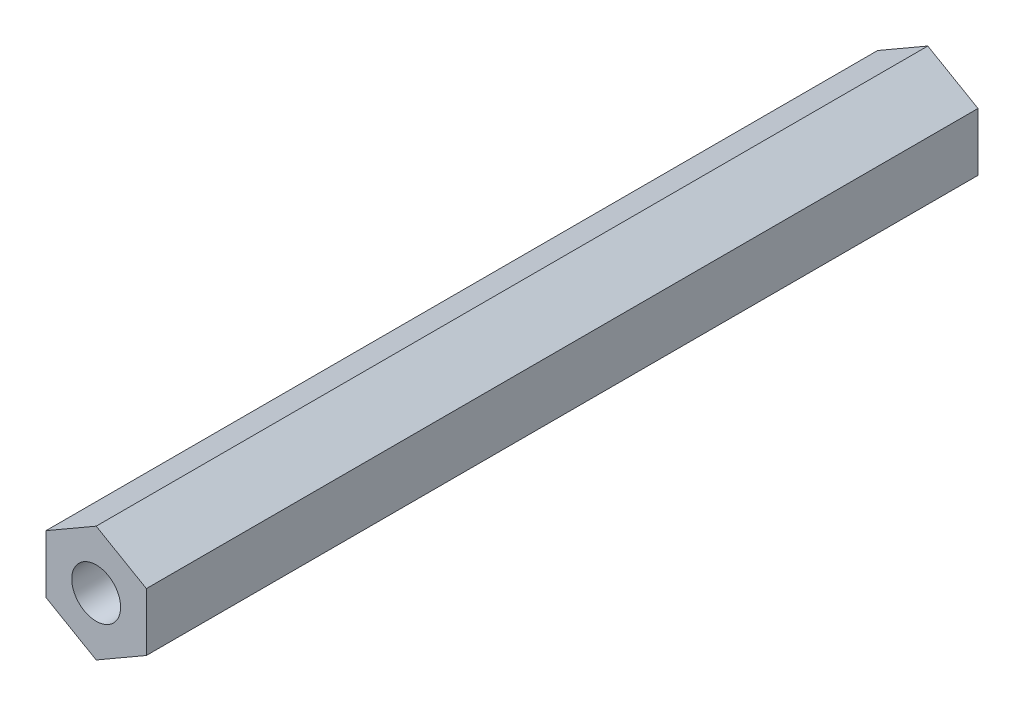
ISO-10303-21;
HEADER;
FILE_DESCRIPTION(('STEP AP214'),'2;1');
FILE_NAME('part.step','',(''),(''),'','','');
FILE_SCHEMA(('AUTOMOTIVE_DESIGN { 1 0 10303 214 1 1 1 1 }'));
ENDSEC;
DATA;
#1=APPLICATION_CONTEXT('core data for automotive mechanical design processes');
#2=APPLICATION_PROTOCOL_DEFINITION('international standard','automotive_design',2000,#1);
#3=PRODUCT_CONTEXT('',#1,'mechanical');
#4=PRODUCT('Part','Part','',(#3));
#5=PRODUCT_RELATED_PRODUCT_CATEGORY('part','',(#4));
#6=PRODUCT_DEFINITION_FORMATION('','',#4);
#7=PRODUCT_DEFINITION_CONTEXT('part definition',#1,'design');
#8=PRODUCT_DEFINITION('design','',#6,#7);
#9=PRODUCT_DEFINITION_SHAPE('','',#8);
#10=(LENGTH_UNIT() NAMED_UNIT(*) SI_UNIT(.MILLI.,.METRE.));
#11=(NAMED_UNIT(*) PLANE_ANGLE_UNIT() SI_UNIT($,.RADIAN.));
#12=(NAMED_UNIT(*) SI_UNIT($,.STERADIAN.) SOLID_ANGLE_UNIT());
#13=UNCERTAINTY_MEASURE_WITH_UNIT(LENGTH_MEASURE(1.E-05),#10,'distance_accuracy_value','');
#14=(GEOMETRIC_REPRESENTATION_CONTEXT(3) GLOBAL_UNCERTAINTY_ASSIGNED_CONTEXT((#13)) GLOBAL_UNIT_ASSIGNED_CONTEXT((#10,
#11,#12)) REPRESENTATION_CONTEXT('',''));
#15=CARTESIAN_POINT('',(0.,0.,0.));
#16=DIRECTION('',(0.,0.,1.));
#17=DIRECTION('',(1.,0.,0.));
#18=AXIS2_PLACEMENT_3D('',#15,#16,#17);
#19=CARTESIAN_POINT('',(5.55624999999995,3.20790243318492,46.0375));
#20=DIRECTION('',(-0.499999999999995,-0.866025403784441,0.));
#21=DIRECTION('',(0.866025403784442,-0.499999999999995,0.));
#22=AXIS2_PLACEMENT_3D('',#19,#20,#21);
#23=PLANE('',#22);
#24=DIRECTION('',(-0.866025403784442,0.499999999999995,0.));
#25=VECTOR('',#24,1.);
#26=CARTESIAN_POINT('',(5.55624999999995,3.20790243318492,-46.0375));
#27=LINE('',#26,#25);
#28=CARTESIAN_POINT('',(5.55624999999995,3.20790243318492,-46.0375));
#29=VERTEX_POINT('',#28);
#30=CARTESIAN_POINT('',(0.,6.41580486636971,-46.0375));
#31=VERTEX_POINT('',#30);
#32=EDGE_CURVE('E123',#29,#31,#27,.T.);
#33=ORIENTED_EDGE('',*,*,#32,.T.);
#34=DIRECTION('',(0.,0.,-1.));
#35=VECTOR('',#34,1.);
#36=CARTESIAN_POINT('',(0.,6.41580486636971,46.0375));
#37=LINE('',#36,#35);
#38=CARTESIAN_POINT('',(0.,6.41580486636971,46.0375));
#39=VERTEX_POINT('',#38);
#40=EDGE_CURVE('E11',#39,#31,#37,.T.);
#41=ORIENTED_EDGE('',*,*,#40,.F.);
#42=DIRECTION('',(-0.866025403784442,0.499999999999995,0.));
#43=VECTOR('',#42,1.);
#44=CARTESIAN_POINT('',(5.55624999999995,3.20790243318492,46.0375));
#45=LINE('',#44,#43);
#46=CARTESIAN_POINT('',(5.55624999999995,3.20790243318492,46.0375));
#47=VERTEX_POINT('',#46);
#48=EDGE_CURVE('E134',#47,#39,#45,.T.);
#49=ORIENTED_EDGE('',*,*,#48,.F.);
#50=DIRECTION('',(0.,0.,-1.));
#51=VECTOR('',#50,1.);
#52=CARTESIAN_POINT('',(5.55624999999995,3.20790243318492,46.0375));
#53=LINE('',#52,#51);
#54=EDGE_CURVE('E119',#47,#29,#53,.T.);
#55=ORIENTED_EDGE('',*,*,#54,.T.);
#56=EDGE_LOOP('',(#33,#41,#49,#55));
#57=FACE_BOUND('',#56,.T.);
#58=ADVANCED_FACE('F39',(#57),#23,.F.);
#59=CARTESIAN_POINT('',(0.,6.41580486636971,46.0375));
#60=DIRECTION('',(0.500000000000001,-0.866025403784438,0.));
#61=DIRECTION('',(0.866025403784438,0.500000000000001,0.));
#62=AXIS2_PLACEMENT_3D('',#59,#60,#61);
#63=PLANE('',#62);
#64=DIRECTION('',(-0.866025403784438,-0.500000000000001,0.));
#65=VECTOR('',#64,1.);
#66=CARTESIAN_POINT('',(0.,6.41580486636971,-46.0375));
#67=LINE('',#66,#65);
#68=CARTESIAN_POINT('',(-5.55625,3.20790243318484,-46.0375));
#69=VERTEX_POINT('',#68);
#70=EDGE_CURVE('E126',#31,#69,#67,.T.);
#71=ORIENTED_EDGE('',*,*,#70,.T.);
#72=DIRECTION('',(0.,0.,-1.));
#73=VECTOR('',#72,1.);
#74=CARTESIAN_POINT('',(-5.55625,3.20790243318484,46.0375));
#75=LINE('',#74,#73);
#76=CARTESIAN_POINT('',(-5.55625,3.20790243318484,46.0375));
#77=VERTEX_POINT('',#76);
#78=EDGE_CURVE('E47',#77,#69,#75,.T.);
#79=ORIENTED_EDGE('',*,*,#78,.F.);
#80=DIRECTION('',(-0.866025403784438,-0.500000000000001,0.));
#81=VECTOR('',#80,1.);
#82=CARTESIAN_POINT('',(0.,6.41580486636971,46.0375));
#83=LINE('',#82,#81);
#84=EDGE_CURVE('E92',#39,#77,#83,.T.);
#85=ORIENTED_EDGE('',*,*,#84,.F.);
#86=ORIENTED_EDGE('',*,*,#40,.T.);
#87=EDGE_LOOP('',(#71,#79,#85,#86));
#88=FACE_BOUND('',#87,.T.);
#89=ADVANCED_FACE('F159',(#88),#63,.F.);
#90=CARTESIAN_POINT('',(-5.55625,3.20790243318484,46.0375));
#91=DIRECTION('',(1.,0.,0.));
#92=DIRECTION('',(0.,1.,0.));
#93=AXIS2_PLACEMENT_3D('',#90,#91,#92);
#94=PLANE('',#93);
#95=DIRECTION('',(0.,-1.,0.));
#96=VECTOR('',#95,1.);
#97=CARTESIAN_POINT('',(-5.55625,3.20790243318484,-46.0375));
#98=LINE('',#97,#96);
#99=CARTESIAN_POINT('',(-5.55624999999998,-3.20790243318488,-46.0375));
#100=VERTEX_POINT('',#99);
#101=EDGE_CURVE('E129',#69,#100,#98,.T.);
#102=ORIENTED_EDGE('',*,*,#101,.T.);
#103=DIRECTION('',(0.,0.,-1.));
#104=VECTOR('',#103,1.);
#105=CARTESIAN_POINT('',(-5.55624999999998,-3.20790243318488,46.0375));
#106=LINE('',#105,#104);
#107=CARTESIAN_POINT('',(-5.55624999999998,-3.20790243318488,46.0375));
#108=VERTEX_POINT('',#107);
#109=EDGE_CURVE('E114',#108,#100,#106,.T.);
#110=ORIENTED_EDGE('',*,*,#109,.F.);
#111=DIRECTION('',(0.,-1.,0.));
#112=VECTOR('',#111,1.);
#113=CARTESIAN_POINT('',(-5.55625,3.20790243318484,46.0375));
#114=LINE('',#113,#112);
#115=EDGE_CURVE('E105',#77,#108,#114,.T.);
#116=ORIENTED_EDGE('',*,*,#115,.F.);
#117=ORIENTED_EDGE('',*,*,#78,.T.);
#118=EDGE_LOOP('',(#102,#110,#116,#117));
#119=FACE_BOUND('',#118,.T.);
#120=ADVANCED_FACE('F140',(#119),#94,.F.);
#121=CARTESIAN_POINT('',(-5.55624999999998,-3.20790243318488,46.0375));
#122=DIRECTION('',(0.499999999999995,0.866025403784441,0.));
#123=DIRECTION('',(-0.866025403784442,0.499999999999995,0.));
#124=AXIS2_PLACEMENT_3D('',#121,#122,#123);
#125=PLANE('',#124);
#126=DIRECTION('',(0.866025403784441,-0.499999999999995,0.));
#127=VECTOR('',#126,1.);
#128=CARTESIAN_POINT('',(-5.55624999999998,-3.20790243318488,-46.0375));
#129=LINE('',#128,#127);
#130=CARTESIAN_POINT('',(0.,-6.41580486636971,-46.0375));
#131=VERTEX_POINT('',#130);
#132=EDGE_CURVE('E113',#100,#131,#129,.T.);
#133=ORIENTED_EDGE('',*,*,#132,.T.);
#134=DIRECTION('',(0.,0.,-1.));
#135=VECTOR('',#134,1.);
#136=CARTESIAN_POINT('',(0.,-6.41580486636971,46.0375));
#137=LINE('',#136,#135);
#138=CARTESIAN_POINT('',(0.,-6.41580486636971,46.0375));
#139=VERTEX_POINT('',#138);
#140=EDGE_CURVE('E110',#139,#131,#137,.T.);
#141=ORIENTED_EDGE('',*,*,#140,.F.);
#142=DIRECTION('',(0.866025403784441,-0.499999999999995,0.));
#143=VECTOR('',#142,1.);
#144=CARTESIAN_POINT('',(-5.55624999999998,-3.20790243318488,46.0375));
#145=LINE('',#144,#143);
#146=EDGE_CURVE('E99',#108,#139,#145,.T.);
#147=ORIENTED_EDGE('',*,*,#146,.F.);
#148=ORIENTED_EDGE('',*,*,#109,.T.);
#149=EDGE_LOOP('',(#133,#141,#147,#148));
#150=FACE_BOUND('',#149,.T.);
#151=ADVANCED_FACE('F111',(#150),#125,.F.);
#152=CARTESIAN_POINT('',(0.,-6.41580486636971,46.0375));
#153=DIRECTION('',(-0.500000000000007,0.866025403784434,0.));
#154=DIRECTION('',(-0.866025403784435,-0.500000000000007,0.));
#155=AXIS2_PLACEMENT_3D('',#152,#153,#154);
#156=PLANE('',#155);
#157=DIRECTION('',(0.866025403784435,0.500000000000007,0.));
#158=VECTOR('',#157,1.);
#159=CARTESIAN_POINT('',(0.,-6.41580486636971,-46.0375));
#160=LINE('',#159,#158);
#161=CARTESIAN_POINT('',(5.55625000000002,-3.2079024331848,-46.0375));
#162=VERTEX_POINT('',#161);
#163=EDGE_CURVE('E78',#131,#162,#160,.T.);
#164=ORIENTED_EDGE('',*,*,#163,.T.);
#165=DIRECTION('',(0.,0.,-1.));
#166=VECTOR('',#165,1.);
#167=CARTESIAN_POINT('',(5.55625000000002,-3.2079024331848,46.0375));
#168=LINE('',#167,#166);
#169=CARTESIAN_POINT('',(5.55625000000002,-3.2079024331848,46.0375));
#170=VERTEX_POINT('',#169);
#171=EDGE_CURVE('E115',#170,#162,#168,.T.);
#172=ORIENTED_EDGE('',*,*,#171,.F.);
#173=DIRECTION('',(0.866025403784435,0.500000000000007,0.));
#174=VECTOR('',#173,1.);
#175=CARTESIAN_POINT('',(0.,-6.41580486636971,46.0375));
#176=LINE('',#175,#174);
#177=EDGE_CURVE('E103',#139,#170,#176,.T.);
#178=ORIENTED_EDGE('',*,*,#177,.F.);
#179=ORIENTED_EDGE('',*,*,#140,.T.);
#180=EDGE_LOOP('',(#164,#172,#178,#179));
#181=FACE_BOUND('',#180,.T.);
#182=ADVANCED_FACE('F117',(#181),#156,.F.);
#183=CARTESIAN_POINT('',(5.55625000000002,-3.2079024331848,46.0375));
#184=DIRECTION('',(-1.,0.,0.));
#185=DIRECTION('',(0.,-1.,0.));
#186=AXIS2_PLACEMENT_3D('',#183,#184,#185);
#187=PLANE('',#186);
#188=DIRECTION('',(0.,1.,0.));
#189=VECTOR('',#188,1.);
#190=CARTESIAN_POINT('',(5.55625000000002,-3.2079024331848,-46.0375));
#191=LINE('',#190,#189);
#192=EDGE_CURVE('E84',#162,#29,#191,.T.);
#193=ORIENTED_EDGE('',*,*,#192,.T.);
#194=ORIENTED_EDGE('',*,*,#54,.F.);
#195=DIRECTION('',(0.,1.,0.));
#196=VECTOR('',#195,1.);
#197=CARTESIAN_POINT('',(5.55625000000002,-3.2079024331848,46.0375));
#198=LINE('',#197,#196);
#199=EDGE_CURVE('E55',#170,#47,#198,.T.);
#200=ORIENTED_EDGE('',*,*,#199,.F.);
#201=ORIENTED_EDGE('',*,*,#171,.T.);
#202=EDGE_LOOP('',(#193,#194,#200,#201));
#203=FACE_BOUND('',#202,.T.);
#204=ADVANCED_FACE('F147',(#203),#187,.F.);
#205=CARTESIAN_POINT('',(0.,0.,46.0375));
#206=DIRECTION('',(0.,0.,1.));
#207=DIRECTION('',(1.,0.,0.));
#208=AXIS2_PLACEMENT_3D('',#205,#206,#207);
#209=PLANE('',#208);
#210=CARTESIAN_POINT('',(0.,0.,46.0375));
#211=DIRECTION('',(0.,0.,1.));
#212=DIRECTION('',(1.,0.,0.));
#213=AXIS2_PLACEMENT_3D('',#210,#211,#212);
#214=CIRCLE('',#213,2.7051);
#215=CARTESIAN_POINT('',(2.7051,0.,46.0375));
#216=VERTEX_POINT('',#215);
#217=EDGE_CURVE('E226',#216,#216,#214,.T.);
#218=ORIENTED_EDGE('',*,*,#217,.F.);
#219=EDGE_LOOP('',(#218));
#220=FACE_BOUND('',#219,.T.);
#221=ORIENTED_EDGE('',*,*,#48,.T.);
#222=ORIENTED_EDGE('',*,*,#84,.T.);
#223=ORIENTED_EDGE('',*,*,#115,.T.);
#224=ORIENTED_EDGE('',*,*,#146,.T.);
#225=ORIENTED_EDGE('',*,*,#177,.T.);
#226=ORIENTED_EDGE('',*,*,#199,.T.);
#227=EDGE_LOOP('',(#221,#222,#223,#224,#225,#226));
#228=FACE_BOUND('',#227,.T.);
#229=ADVANCED_FACE('F101',(#220,#228),#209,.T.);
#230=CARTESIAN_POINT('',(0.,0.,-46.0375));
#231=DIRECTION('',(0.,0.,1.));
#232=DIRECTION('',(1.,0.,0.));
#233=AXIS2_PLACEMENT_3D('',#230,#231,#232);
#234=PLANE('',#233);
#235=CARTESIAN_POINT('',(0.,0.,-46.0375));
#236=DIRECTION('',(0.,0.,-1.));
#237=DIRECTION('',(-1.,0.,0.));
#238=AXIS2_PLACEMENT_3D('',#235,#236,#237);
#239=CIRCLE('',#238,2.7051);
#240=CARTESIAN_POINT('',(-2.7051,0.,-46.0375));
#241=VERTEX_POINT('',#240);
#242=EDGE_CURVE('E227',#241,#241,#239,.T.);
#243=ORIENTED_EDGE('',*,*,#242,.F.);
#244=EDGE_LOOP('',(#243));
#245=FACE_BOUND('',#244,.T.);
#246=ORIENTED_EDGE('',*,*,#32,.F.);
#247=ORIENTED_EDGE('',*,*,#192,.F.);
#248=ORIENTED_EDGE('',*,*,#163,.F.);
#249=ORIENTED_EDGE('',*,*,#132,.F.);
#250=ORIENTED_EDGE('',*,*,#101,.F.);
#251=ORIENTED_EDGE('',*,*,#70,.F.);
#252=EDGE_LOOP('',(#246,#247,#248,#249,#250,#251));
#253=FACE_BOUND('',#252,.T.);
#254=ADVANCED_FACE('F143',(#245,#253),#234,.F.);
#255=CARTESIAN_POINT('',(0.,0.,7.9375));
#256=DIRECTION('',(0.,0.,1.));
#257=DIRECTION('',(1.,0.,0.));
#258=AXIS2_PLACEMENT_3D('',#255,#256,#257);
#259=CYLINDRICAL_SURFACE('',#258,2.7051);
#260=CARTESIAN_POINT('',(0.,0.,7.9375));
#261=DIRECTION('',(0.,0.,1.));
#262=DIRECTION('',(1.,0.,0.));
#263=AXIS2_PLACEMENT_3D('',#260,#261,#262);
#264=CIRCLE('',#263,2.7051);
#265=CARTESIAN_POINT('',(2.7051,0.,7.9375));
#266=VERTEX_POINT('',#265);
#267=EDGE_CURVE('E127',#266,#266,#264,.T.);
#268=CARTESIAN_POINT('',(2.7051,0.,7.9375));
#269=CARTESIAN_POINT('',(2.7051,0.,8.334375));
#270=CARTESIAN_POINT('',(2.7051,0.,8.73125));
#271=CARTESIAN_POINT('',(2.7051,0.,9.525));
#272=CARTESIAN_POINT('',(2.7051,0.,9.921875));
#273=CARTESIAN_POINT('',(2.7051,0.,10.715625));
#274=CARTESIAN_POINT('',(2.7051,0.,11.1125));
#275=CARTESIAN_POINT('',(2.7051,0.,11.90625));
#276=CARTESIAN_POINT('',(2.7051,0.,12.303125));
#277=CARTESIAN_POINT('',(2.7051,0.,13.096875));
#278=CARTESIAN_POINT('',(2.7051,0.,13.49375));
#279=CARTESIAN_POINT('',(2.7051,0.,14.2875));
#280=CARTESIAN_POINT('',(2.7051,0.,14.684375));
#281=CARTESIAN_POINT('',(2.7051,0.,15.478125));
#282=CARTESIAN_POINT('',(2.7051,0.,15.875));
#283=CARTESIAN_POINT('',(2.7051,0.,16.66875));
#284=CARTESIAN_POINT('',(2.7051,0.,17.065625));
#285=CARTESIAN_POINT('',(2.7051,0.,17.859375));
#286=CARTESIAN_POINT('',(2.7051,0.,18.25625));
#287=CARTESIAN_POINT('',(2.7051,0.,19.05));
#288=CARTESIAN_POINT('',(2.7051,0.,19.446875));
#289=CARTESIAN_POINT('',(2.7051,0.,20.240625));
#290=CARTESIAN_POINT('',(2.7051,0.,20.6375));
#291=CARTESIAN_POINT('',(2.7051,0.,21.43125));
#292=CARTESIAN_POINT('',(2.7051,0.,21.828125));
#293=CARTESIAN_POINT('',(2.7051,0.,22.621875));
#294=CARTESIAN_POINT('',(2.7051,0.,23.01875));
#295=CARTESIAN_POINT('',(2.7051,0.,23.8125));
#296=CARTESIAN_POINT('',(2.7051,0.,24.209375));
#297=CARTESIAN_POINT('',(2.7051,0.,25.003125));
#298=CARTESIAN_POINT('',(2.7051,0.,25.4));
#299=CARTESIAN_POINT('',(2.7051,0.,26.19375));
#300=CARTESIAN_POINT('',(2.7051,0.,26.590625));
#301=CARTESIAN_POINT('',(2.7051,0.,27.384375));
#302=CARTESIAN_POINT('',(2.7051,0.,27.78125));
#303=CARTESIAN_POINT('',(2.7051,0.,28.575));
#304=CARTESIAN_POINT('',(2.7051,0.,28.971875));
#305=CARTESIAN_POINT('',(2.7051,0.,29.765625));
#306=CARTESIAN_POINT('',(2.7051,0.,30.1625));
#307=CARTESIAN_POINT('',(2.7051,0.,30.95625));
#308=CARTESIAN_POINT('',(2.7051,0.,31.353125));
#309=CARTESIAN_POINT('',(2.7051,0.,32.146875));
#310=CARTESIAN_POINT('',(2.7051,0.,32.54375));
#311=CARTESIAN_POINT('',(2.7051,0.,33.3375));
#312=CARTESIAN_POINT('',(2.7051,0.,33.734375));
#313=CARTESIAN_POINT('',(2.7051,0.,34.528125));
#314=CARTESIAN_POINT('',(2.7051,0.,34.925));
#315=CARTESIAN_POINT('',(2.7051,0.,35.71875));
#316=CARTESIAN_POINT('',(2.7051,0.,36.115625));
#317=CARTESIAN_POINT('',(2.7051,0.,36.909375));
#318=CARTESIAN_POINT('',(2.7051,0.,37.30625));
#319=CARTESIAN_POINT('',(2.7051,0.,38.1));
#320=CARTESIAN_POINT('',(2.7051,0.,38.496875));
#321=CARTESIAN_POINT('',(2.7051,0.,39.290625));
#322=CARTESIAN_POINT('',(2.7051,0.,39.6875));
#323=CARTESIAN_POINT('',(2.7051,0.,40.48125));
#324=CARTESIAN_POINT('',(2.7051,0.,40.878125));
#325=CARTESIAN_POINT('',(2.7051,0.,41.671875));
#326=CARTESIAN_POINT('',(2.7051,0.,42.06875));
#327=CARTESIAN_POINT('',(2.7051,0.,42.8625));
#328=CARTESIAN_POINT('',(2.7051,0.,43.259375));
#329=CARTESIAN_POINT('',(2.7051,0.,44.053125));
#330=CARTESIAN_POINT('',(2.7051,0.,44.45));
#331=CARTESIAN_POINT('',(2.7051,0.,45.24375));
#332=CARTESIAN_POINT('',(2.7051,0.,45.640625));
#333=CARTESIAN_POINT('',(2.7051,0.,46.0375));
#334=B_SPLINE_CURVE_WITH_KNOTS('',3,(#268,#269,#270,#271,#272,#273,#274,#275,#276,#277,#278,
#279,#280,#281,#282,#283,#284,#285,#286,#287,#288,#289,#290,#291,#292,#293,#294,#295,#296,#297,
#298,#299,#300,#301,#302,#303,#304,#305,#306,#307,#308,#309,#310,#311,#312,#313,#314,#315,#316,
#317,#318,#319,#320,#321,#322,#323,#324,#325,#326,#327,#328,#329,#330,#331,#332,#333),
.UNSPECIFIED.,.F.,.F.,(4,2,2,2,2,2,2,2,2,2,2,2,2,2,2,2,2,2,2,2,2,2,2,2,2,2,2,2,2,2,2,2,4),(0.,
1.190625,2.38125,3.571875,4.7625,5.953125,7.14375,8.334375,9.525,10.715625,11.90625,13.096875,
14.2875,15.478125,16.66875,17.859375,19.05,20.240625,21.43125,22.621875,23.8125,25.003125,
26.19375,27.384375,28.575,29.765625,30.95625,32.146875,33.3375,34.528125,35.71875,36.909375,
38.1),.UNSPECIFIED.);
#335=EDGE_CURVE('BSEAM191',#266,#216,#334,.T.);
#336=ORIENTED_EDGE('',*,*,#267,.F.);
#337=ORIENTED_EDGE('',*,*,#217,.T.);
#338=ORIENTED_EDGE('',*,*,#335,.T.);
#339=ORIENTED_EDGE('',*,*,#335,.F.);
#340=EDGE_LOOP('',(#336,#338,#337,#339));
#341=FACE_BOUND('',#340,.T.);
#342=ADVANCED_FACE('F191',(#341),#259,.F.);
#343=CARTESIAN_POINT('',(0.,0.,7.9375));
#344=DIRECTION('',(0.,0.,1.));
#345=DIRECTION('',(1.,0.,0.));
#346=AXIS2_PLACEMENT_3D('',#343,#344,#345);
#347=PLANE('',#346);
#348=ORIENTED_EDGE('',*,*,#267,.T.);
#349=EDGE_LOOP('',(#348));
#350=FACE_BOUND('',#349,.T.);
#351=ADVANCED_FACE('F199',(#350),#347,.T.);
#352=CARTESIAN_POINT('',(0.,0.,-7.9375));
#353=DIRECTION('',(0.,0.,-1.));
#354=DIRECTION('',(-1.,0.,0.));
#355=AXIS2_PLACEMENT_3D('',#352,#353,#354);
#356=CYLINDRICAL_SURFACE('',#355,2.7051);
#357=CARTESIAN_POINT('',(0.,0.,-7.9375));
#358=DIRECTION('',(0.,0.,-1.));
#359=DIRECTION('',(-1.,0.,0.));
#360=AXIS2_PLACEMENT_3D('',#357,#358,#359);
#361=CIRCLE('',#360,2.7051);
#362=CARTESIAN_POINT('',(-2.7051,0.,-7.9375));
#363=VERTEX_POINT('',#362);
#364=EDGE_CURVE('E225',#363,#363,#361,.T.);
#365=CARTESIAN_POINT('',(-2.7051,0.,-7.9375));
#366=CARTESIAN_POINT('',(-2.7051,0.,-8.334375));
#367=CARTESIAN_POINT('',(-2.7051,0.,-8.73125));
#368=CARTESIAN_POINT('',(-2.7051,0.,-9.525));
#369=CARTESIAN_POINT('',(-2.7051,0.,-9.921875));
#370=CARTESIAN_POINT('',(-2.7051,0.,-10.715625));
#371=CARTESIAN_POINT('',(-2.7051,0.,-11.1125));
#372=CARTESIAN_POINT('',(-2.7051,0.,-11.90625));
#373=CARTESIAN_POINT('',(-2.7051,0.,-12.303125));
#374=CARTESIAN_POINT('',(-2.7051,0.,-13.096875));
#375=CARTESIAN_POINT('',(-2.7051,0.,-13.49375));
#376=CARTESIAN_POINT('',(-2.7051,0.,-14.2875));
#377=CARTESIAN_POINT('',(-2.7051,0.,-14.684375));
#378=CARTESIAN_POINT('',(-2.7051,0.,-15.478125));
#379=CARTESIAN_POINT('',(-2.7051,0.,-15.875));
#380=CARTESIAN_POINT('',(-2.7051,0.,-16.66875));
#381=CARTESIAN_POINT('',(-2.7051,0.,-17.065625));
#382=CARTESIAN_POINT('',(-2.7051,0.,-17.859375));
#383=CARTESIAN_POINT('',(-2.7051,0.,-18.25625));
#384=CARTESIAN_POINT('',(-2.7051,0.,-19.05));
#385=CARTESIAN_POINT('',(-2.7051,0.,-19.446875));
#386=CARTESIAN_POINT('',(-2.7051,0.,-20.240625));
#387=CARTESIAN_POINT('',(-2.7051,0.,-20.6375));
#388=CARTESIAN_POINT('',(-2.7051,0.,-21.43125));
#389=CARTESIAN_POINT('',(-2.7051,0.,-21.828125));
#390=CARTESIAN_POINT('',(-2.7051,0.,-22.621875));
#391=CARTESIAN_POINT('',(-2.7051,0.,-23.01875));
#392=CARTESIAN_POINT('',(-2.7051,0.,-23.8125));
#393=CARTESIAN_POINT('',(-2.7051,0.,-24.209375));
#394=CARTESIAN_POINT('',(-2.7051,0.,-25.003125));
#395=CARTESIAN_POINT('',(-2.7051,0.,-25.4));
#396=CARTESIAN_POINT('',(-2.7051,0.,-26.19375));
#397=CARTESIAN_POINT('',(-2.7051,0.,-26.590625));
#398=CARTESIAN_POINT('',(-2.7051,0.,-27.384375));
#399=CARTESIAN_POINT('',(-2.7051,0.,-27.78125));
#400=CARTESIAN_POINT('',(-2.7051,0.,-28.575));
#401=CARTESIAN_POINT('',(-2.7051,0.,-28.971875));
#402=CARTESIAN_POINT('',(-2.7051,0.,-29.765625));
#403=CARTESIAN_POINT('',(-2.7051,0.,-30.1625));
#404=CARTESIAN_POINT('',(-2.7051,0.,-30.95625));
#405=CARTESIAN_POINT('',(-2.7051,0.,-31.353125));
#406=CARTESIAN_POINT('',(-2.7051,0.,-32.146875));
#407=CARTESIAN_POINT('',(-2.7051,0.,-32.54375));
#408=CARTESIAN_POINT('',(-2.7051,0.,-33.3375));
#409=CARTESIAN_POINT('',(-2.7051,0.,-33.734375));
#410=CARTESIAN_POINT('',(-2.7051,0.,-34.528125));
#411=CARTESIAN_POINT('',(-2.7051,0.,-34.925));
#412=CARTESIAN_POINT('',(-2.7051,0.,-35.71875));
#413=CARTESIAN_POINT('',(-2.7051,0.,-36.115625));
#414=CARTESIAN_POINT('',(-2.7051,0.,-36.909375));
#415=CARTESIAN_POINT('',(-2.7051,0.,-37.30625));
#416=CARTESIAN_POINT('',(-2.7051,0.,-38.1));
#417=CARTESIAN_POINT('',(-2.7051,0.,-38.496875));
#418=CARTESIAN_POINT('',(-2.7051,0.,-39.290625));
#419=CARTESIAN_POINT('',(-2.7051,0.,-39.6875));
#420=CARTESIAN_POINT('',(-2.7051,0.,-40.48125));
#421=CARTESIAN_POINT('',(-2.7051,0.,-40.878125));
#422=CARTESIAN_POINT('',(-2.7051,0.,-41.671875));
#423=CARTESIAN_POINT('',(-2.7051,0.,-42.06875));
#424=CARTESIAN_POINT('',(-2.7051,0.,-42.8625));
#425=CARTESIAN_POINT('',(-2.7051,0.,-43.259375));
#426=CARTESIAN_POINT('',(-2.7051,0.,-44.053125));
#427=CARTESIAN_POINT('',(-2.7051,0.,-44.45));
#428=CARTESIAN_POINT('',(-2.7051,0.,-45.24375));
#429=CARTESIAN_POINT('',(-2.7051,0.,-45.640625));
#430=CARTESIAN_POINT('',(-2.7051,0.,-46.0375));
#431=B_SPLINE_CURVE_WITH_KNOTS('',3,(#365,#366,#367,#368,#369,#370,#371,#372,#373,#374,#375,
#376,#377,#378,#379,#380,#381,#382,#383,#384,#385,#386,#387,#388,#389,#390,#391,#392,#393,#394,
#395,#396,#397,#398,#399,#400,#401,#402,#403,#404,#405,#406,#407,#408,#409,#410,#411,#412,#413,
#414,#415,#416,#417,#418,#419,#420,#421,#422,#423,#424,#425,#426,#427,#428,#429,#430),
.UNSPECIFIED.,.F.,.F.,(4,2,2,2,2,2,2,2,2,2,2,2,2,2,2,2,2,2,2,2,2,2,2,2,2,2,2,2,2,2,2,2,4),(0.,
1.190625,2.38125,3.571875,4.7625,5.953125,7.14375,8.334375,9.525,10.715625,11.90625,13.096875,
14.2875,15.478125,16.66875,17.859375,19.05,20.240625,21.43125,22.621875,23.8125,25.003125,
26.19375,27.384375,28.575,29.765625,30.95625,32.146875,33.3375,34.528125,35.71875,36.909375,
38.1),.UNSPECIFIED.);
#432=EDGE_CURVE('BSEAM206',#363,#241,#431,.T.);
#433=ORIENTED_EDGE('',*,*,#364,.F.);
#434=ORIENTED_EDGE('',*,*,#242,.T.);
#435=ORIENTED_EDGE('',*,*,#432,.T.);
#436=ORIENTED_EDGE('',*,*,#432,.F.);
#437=EDGE_LOOP('',(#433,#435,#434,#436));
#438=FACE_BOUND('',#437,.T.);
#439=ADVANCED_FACE('F206',(#438),#356,.F.);
#440=CARTESIAN_POINT('',(0.,0.,-7.9375));
#441=DIRECTION('',(0.,0.,-1.));
#442=DIRECTION('',(-1.,0.,0.));
#443=AXIS2_PLACEMENT_3D('',#440,#441,#442);
#444=PLANE('',#443);
#445=ORIENTED_EDGE('',*,*,#364,.T.);
#446=EDGE_LOOP('',(#445));
#447=FACE_BOUND('',#446,.T.);
#448=ADVANCED_FACE('F213',(#447),#444,.T.);
#449=CLOSED_SHELL('',(#58,#89,#120,#151,#182,#204,#229,#254,#342,#351,#439,#448));
#450=MANIFOLD_SOLID_BREP('B2',#449);
#451=ADVANCED_BREP_SHAPE_REPRESENTATION('',(#18,#450),#14);
#452=SHAPE_DEFINITION_REPRESENTATION(#9,#451);
ENDSEC;
END-ISO-10303-21;
